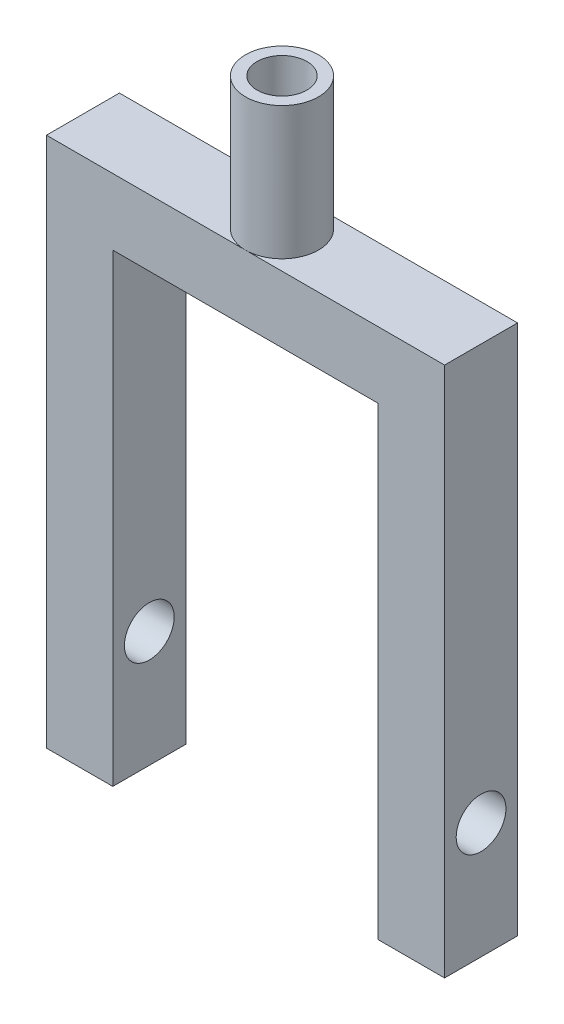
ISO-10303-21;
HEADER;
FILE_DESCRIPTION(('STEP AP214'),'2;1');
FILE_NAME('part.step','',(''),(''),'','','');
FILE_SCHEMA(('AUTOMOTIVE_DESIGN { 1 0 10303 214 1 1 1 1 }'));
ENDSEC;
DATA;
#1=APPLICATION_CONTEXT('core data for automotive mechanical design processes');
#2=APPLICATION_PROTOCOL_DEFINITION('international standard','automotive_design',2000,#1);
#3=PRODUCT_CONTEXT('',#1,'mechanical');
#4=PRODUCT('Part','Part','',(#3));
#5=PRODUCT_RELATED_PRODUCT_CATEGORY('part','',(#4));
#6=PRODUCT_DEFINITION_FORMATION('','',#4);
#7=PRODUCT_DEFINITION_CONTEXT('part definition',#1,'design');
#8=PRODUCT_DEFINITION('design','',#6,#7);
#9=PRODUCT_DEFINITION_SHAPE('','',#8);
#10=(LENGTH_UNIT() NAMED_UNIT(*) SI_UNIT(.MILLI.,.METRE.));
#11=(NAMED_UNIT(*) PLANE_ANGLE_UNIT() SI_UNIT($,.RADIAN.));
#12=(NAMED_UNIT(*) SI_UNIT($,.STERADIAN.) SOLID_ANGLE_UNIT());
#13=UNCERTAINTY_MEASURE_WITH_UNIT(LENGTH_MEASURE(1.E-05),#10,'distance_accuracy_value','');
#14=(GEOMETRIC_REPRESENTATION_CONTEXT(3) GLOBAL_UNCERTAINTY_ASSIGNED_CONTEXT((#13)) GLOBAL_UNIT_ASSIGNED_CONTEXT((#10,
#11,#12)) REPRESENTATION_CONTEXT('',''));
#15=CARTESIAN_POINT('',(0.,0.,0.));
#16=DIRECTION('',(0.,0.,1.));
#17=DIRECTION('',(1.,0.,0.));
#18=AXIS2_PLACEMENT_3D('',#15,#16,#17);
#19=CARTESIAN_POINT('',(0.,-127.,0.));
#20=DIRECTION('',(0.,-1.,0.));
#21=DIRECTION('',(0.,0.,-1.));
#22=AXIS2_PLACEMENT_3D('',#19,#20,#21);
#23=PLANE('',#22);
#24=DIRECTION('',(0.,0.,-1.));
#25=VECTOR('',#24,1.);
#26=CARTESIAN_POINT('',(25.3999999999999,-127.,6.98500000000001));
#27=LINE('',#26,#25);
#28=CARTESIAN_POINT('',(25.3999999999999,-127.,6.98500000000001));
#29=VERTEX_POINT('',#28);
#30=CARTESIAN_POINT('',(25.3999999999999,-127.,-6.985));
#31=VERTEX_POINT('',#30);
#32=EDGE_CURVE('E107',#29,#31,#27,.T.);
#33=ORIENTED_EDGE('',*,*,#32,.T.);
#34=DIRECTION('',(1.,0.,0.));
#35=VECTOR('',#34,1.);
#36=CARTESIAN_POINT('',(-38.1,-127.,-6.98500000000001));
#37=LINE('',#36,#35);
#38=CARTESIAN_POINT('',(38.1,-127.,-6.985));
#39=VERTEX_POINT('',#38);
#40=EDGE_CURVE('E131',#31,#39,#37,.T.);
#41=ORIENTED_EDGE('',*,*,#40,.T.);
#42=DIRECTION('',(0.,0.,1.));
#43=VECTOR('',#42,1.);
#44=CARTESIAN_POINT('',(38.1,-127.,6.985));
#45=LINE('',#44,#43);
#46=CARTESIAN_POINT('',(38.1,-127.,6.985));
#47=VERTEX_POINT('',#46);
#48=EDGE_CURVE('E126',#39,#47,#45,.T.);
#49=ORIENTED_EDGE('',*,*,#48,.T.);
#50=DIRECTION('',(-1.,0.,0.));
#51=VECTOR('',#50,1.);
#52=CARTESIAN_POINT('',(-38.1,-127.,6.98499999999999));
#53=LINE('',#52,#51);
#54=EDGE_CURVE('E119',#47,#29,#53,.T.);
#55=ORIENTED_EDGE('',*,*,#54,.T.);
#56=EDGE_LOOP('',(#33,#41,#49,#55));
#57=FACE_BOUND('',#56,.T.);
#58=ADVANCED_FACE('F34',(#57),#23,.T.);
#59=CARTESIAN_POINT('',(0.,-25.4,0.));
#60=DIRECTION('',(0.,1.,0.));
#61=DIRECTION('',(0.,0.,1.));
#62=AXIS2_PLACEMENT_3D('',#59,#60,#61);
#63=CYLINDRICAL_SURFACE('',#62,6.985);
#64=CARTESIAN_POINT('',(0.,-25.4,0.));
#65=DIRECTION('',(0.,1.,0.));
#66=DIRECTION('',(0.,0.,1.));
#67=AXIS2_PLACEMENT_3D('',#64,#65,#66);
#68=CIRCLE('',#67,6.985);
#69=CARTESIAN_POINT('',(0.,-25.4,6.985));
#70=VERTEX_POINT('',#69);
#71=CARTESIAN_POINT('',(0.,-25.4,-6.985));
#72=VERTEX_POINT('',#71);
#73=EDGE_CURVE('E11',#70,#72,#68,.T.);
#74=ORIENTED_EDGE('',*,*,#73,.T.);
#75=EDGE_CURVE('E43',#72,#70,#68,.T.);
#76=ORIENTED_EDGE('',*,*,#75,.T.);
#77=EDGE_LOOP('',(#74,#76));
#78=FACE_BOUND('',#77,.T.);
#79=CARTESIAN_POINT('',(0.,0.,0.));
#80=DIRECTION('',(0.,1.,0.));
#81=DIRECTION('',(0.,0.,1.));
#82=AXIS2_PLACEMENT_3D('',#79,#80,#81);
#83=CIRCLE('',#82,6.985);
#84=CARTESIAN_POINT('',(0.,0.,6.985));
#85=VERTEX_POINT('',#84);
#86=EDGE_CURVE('E163',#85,#85,#83,.T.);
#87=ORIENTED_EDGE('',*,*,#86,.F.);
#88=EDGE_LOOP('',(#87));
#89=FACE_BOUND('',#88,.T.);
#90=ADVANCED_FACE('F36',(#78,#89),#63,.T.);
#91=CARTESIAN_POINT('',(0.,0.,0.));
#92=DIRECTION('',(0.,1.,0.));
#93=DIRECTION('',(0.,0.,1.));
#94=AXIS2_PLACEMENT_3D('',#91,#92,#93);
#95=PLANE('',#94);
#96=CARTESIAN_POINT('',(0.,0.,0.));
#97=DIRECTION('',(0.,1.,0.));
#98=DIRECTION('',(0.,0.,1.));
#99=AXIS2_PLACEMENT_3D('',#96,#97,#98);
#100=CIRCLE('',#99,4.7625);
#101=CARTESIAN_POINT('',(0.,0.,4.7625));
#102=VERTEX_POINT('',#101);
#103=EDGE_CURVE('E161',#102,#102,#100,.T.);
#104=ORIENTED_EDGE('',*,*,#103,.F.);
#105=EDGE_LOOP('',(#104));
#106=FACE_BOUND('',#105,.T.);
#107=ORIENTED_EDGE('',*,*,#86,.T.);
#108=EDGE_LOOP('',(#107));
#109=FACE_BOUND('',#108,.T.);
#110=ADVANCED_FACE('F236',(#106,#109),#95,.T.);
#111=CARTESIAN_POINT('',(0.,-63.5,0.));
#112=DIRECTION('',(0.,1.,0.));
#113=DIRECTION('',(0.,0.,1.));
#114=AXIS2_PLACEMENT_3D('',#111,#112,#113);
#115=CYLINDRICAL_SURFACE('',#114,4.7625);
#116=ORIENTED_EDGE('',*,*,#103,.T.);
#117=EDGE_LOOP('',(#116));
#118=FACE_BOUND('',#117,.T.);
#119=CARTESIAN_POINT('',(0.,-38.1,0.));
#120=DIRECTION('',(0.,1.,0.));
#121=DIRECTION('',(-1.,0.,0.));
#122=AXIS2_PLACEMENT_3D('',#119,#120,#121);
#123=CIRCLE('',#122,4.7625);
#124=CARTESIAN_POINT('',(-4.7625,-38.1,0.));
#125=VERTEX_POINT('',#124);
#126=EDGE_CURVE('E166',#125,#125,#123,.T.);
#127=ORIENTED_EDGE('',*,*,#126,.F.);
#128=EDGE_LOOP('',(#127));
#129=FACE_BOUND('',#128,.T.);
#130=ADVANCED_FACE('F244',(#118,#129),#115,.F.);
#131=CARTESIAN_POINT('',(0.,-25.4,0.));
#132=DIRECTION('',(0.,-1.,0.));
#133=DIRECTION('',(0.,0.,-1.));
#134=AXIS2_PLACEMENT_3D('',#131,#132,#133);
#135=PLANE('',#134);
#136=ORIENTED_EDGE('',*,*,#75,.F.);
#137=DIRECTION('',(1.,0.,0.));
#138=VECTOR('',#137,1.);
#139=CARTESIAN_POINT('',(-38.1,-25.4,-6.98500000000001));
#140=LINE('',#139,#138);
#141=CARTESIAN_POINT('',(-38.1,-25.4,-6.98500000000001));
#142=VERTEX_POINT('',#141);
#143=EDGE_CURVE('E148',#142,#72,#140,.T.);
#144=ORIENTED_EDGE('',*,*,#143,.F.);
#145=DIRECTION('',(0.,0.,-1.));
#146=VECTOR('',#145,1.);
#147=CARTESIAN_POINT('',(-38.1,-25.4,6.98499999999999));
#148=LINE('',#147,#146);
#149=CARTESIAN_POINT('',(-38.1,-25.4,6.98499999999999));
#150=VERTEX_POINT('',#149);
#151=EDGE_CURVE('E145',#150,#142,#148,.T.);
#152=ORIENTED_EDGE('',*,*,#151,.F.);
#153=DIRECTION('',(-1.,0.,0.));
#154=VECTOR('',#153,1.);
#155=CARTESIAN_POINT('',(-38.1,-25.4,6.98499999999999));
#156=LINE('',#155,#154);
#157=EDGE_CURVE('E142',#70,#150,#156,.T.);
#158=ORIENTED_EDGE('',*,*,#157,.F.);
#159=EDGE_LOOP('',(#136,#144,#152,#158));
#160=FACE_BOUND('',#159,.T.);
#161=ADVANCED_FACE('F210',(#160),#135,.F.);
#162=DIRECTION('',(0.,0.,-1.));
#163=VECTOR('',#162,1.);
#164=CARTESIAN_POINT('',(-25.4000000000001,-127.,6.98500000000001));
#165=LINE('',#164,#163);
#166=CARTESIAN_POINT('',(-25.4000000000001,-127.,6.98500000000001));
#167=VERTEX_POINT('',#166);
#168=CARTESIAN_POINT('',(-25.4000000000001,-127.,-6.985));
#169=VERTEX_POINT('',#168);
#170=EDGE_CURVE('E116',#167,#169,#165,.T.);
#171=ORIENTED_EDGE('',*,*,#170,.F.);
#172=CARTESIAN_POINT('',(-38.1,-127.,6.98499999999999));
#173=VERTEX_POINT('',#172);
#174=EDGE_CURVE('E129',#167,#173,#53,.T.);
#175=ORIENTED_EDGE('',*,*,#174,.T.);
#176=DIRECTION('',(0.,0.,-1.));
#177=VECTOR('',#176,1.);
#178=CARTESIAN_POINT('',(-38.1,-127.,6.98499999999999));
#179=LINE('',#178,#177);
#180=CARTESIAN_POINT('',(-38.1,-127.,-6.98500000000001));
#181=VERTEX_POINT('',#180);
#182=EDGE_CURVE('E128',#173,#181,#179,.T.);
#183=ORIENTED_EDGE('',*,*,#182,.T.);
#184=EDGE_CURVE('E135',#181,#169,#37,.T.);
#185=ORIENTED_EDGE('',*,*,#184,.T.);
#186=EDGE_LOOP('',(#171,#175,#183,#185));
#187=FACE_BOUND('',#186,.T.);
#188=ADVANCED_FACE('F201',(#187),#23,.T.);
#189=CARTESIAN_POINT('',(-38.1,-127.,-6.98500000000001));
#190=DIRECTION('',(0.,0.,1.));
#191=DIRECTION('',(1.,0.,0.));
#192=AXIS2_PLACEMENT_3D('',#189,#190,#191);
#193=PLANE('',#192);
#194=ORIENTED_EDGE('',*,*,#40,.F.);
#195=DIRECTION('',(0.,-1.,0.));
#196=VECTOR('',#195,1.);
#197=CARTESIAN_POINT('',(25.3999999999999,-38.1,-6.985));
#198=LINE('',#197,#196);
#199=CARTESIAN_POINT('',(25.3999999999999,-38.1,-6.985));
#200=VERTEX_POINT('',#199);
#201=EDGE_CURVE('E112',#200,#31,#198,.T.);
#202=ORIENTED_EDGE('',*,*,#201,.F.);
#203=DIRECTION('',(1.,0.,0.));
#204=VECTOR('',#203,1.);
#205=CARTESIAN_POINT('',(-25.4000000000001,-38.1,-6.985));
#206=LINE('',#205,#204);
#207=CARTESIAN_POINT('',(-25.4000000000001,-38.1,-6.985));
#208=VERTEX_POINT('',#207);
#209=EDGE_CURVE('E123',#208,#200,#206,.T.);
#210=ORIENTED_EDGE('',*,*,#209,.F.);
#211=DIRECTION('',(0.,1.,0.));
#212=VECTOR('',#211,1.);
#213=CARTESIAN_POINT('',(-25.4000000000001,-38.1,-6.985));
#214=LINE('',#213,#212);
#215=EDGE_CURVE('E171',#169,#208,#214,.T.);
#216=ORIENTED_EDGE('',*,*,#215,.F.);
#217=ORIENTED_EDGE('',*,*,#184,.F.);
#218=DIRECTION('',(0.,1.,0.));
#219=VECTOR('',#218,1.);
#220=CARTESIAN_POINT('',(-38.1,-127.,-6.98500000000001));
#221=LINE('',#220,#219);
#222=EDGE_CURVE('E153',#181,#142,#221,.T.);
#223=ORIENTED_EDGE('',*,*,#222,.T.);
#224=ORIENTED_EDGE('',*,*,#143,.T.);
#225=CARTESIAN_POINT('',(38.1,-25.4,-6.985));
#226=VERTEX_POINT('',#225);
#227=EDGE_CURVE('E147',#72,#226,#140,.T.);
#228=ORIENTED_EDGE('',*,*,#227,.T.);
#229=DIRECTION('',(0.,1.,0.));
#230=VECTOR('',#229,1.);
#231=CARTESIAN_POINT('',(38.1,-127.,-6.985));
#232=LINE('',#231,#230);
#233=EDGE_CURVE('E138',#39,#226,#232,.T.);
#234=ORIENTED_EDGE('',*,*,#233,.F.);
#235=EDGE_LOOP('',(#194,#202,#210,#216,#217,#223,#224,#228,#234));
#236=FACE_BOUND('',#235,.T.);
#237=ADVANCED_FACE('F200',(#236),#193,.F.);
#238=CARTESIAN_POINT('',(-38.1,-127.,6.98499999999999));
#239=DIRECTION('',(1.,0.,0.));
#240=DIRECTION('',(0.,0.,-1.));
#241=AXIS2_PLACEMENT_3D('',#238,#239,#240);
#242=PLANE('',#241);
#243=CARTESIAN_POINT('',(-38.1,-104.775,0.));
#244=DIRECTION('',(-1.,0.,0.));
#245=DIRECTION('',(0.,0.,1.));
#246=AXIS2_PLACEMENT_3D('',#243,#244,#245);
#247=CIRCLE('',#246,4.7625);
#248=CARTESIAN_POINT('',(-38.1,-104.775,4.76249999999999));
#249=VERTEX_POINT('',#248);
#250=EDGE_CURVE('E256',#249,#249,#247,.T.);
#251=ORIENTED_EDGE('',*,*,#250,.F.);
#252=EDGE_LOOP('',(#251));
#253=FACE_BOUND('',#252,.T.);
#254=ORIENTED_EDGE('',*,*,#151,.T.);
#255=ORIENTED_EDGE('',*,*,#222,.F.);
#256=ORIENTED_EDGE('',*,*,#182,.F.);
#257=DIRECTION('',(0.,1.,0.));
#258=VECTOR('',#257,1.);
#259=CARTESIAN_POINT('',(-38.1,-127.,6.98499999999999));
#260=LINE('',#259,#258);
#261=EDGE_CURVE('E156',#173,#150,#260,.T.);
#262=ORIENTED_EDGE('',*,*,#261,.T.);
#263=EDGE_LOOP('',(#254,#255,#256,#262));
#264=FACE_BOUND('',#263,.T.);
#265=ADVANCED_FACE('F206',(#253,#264),#242,.F.);
#266=CARTESIAN_POINT('',(-38.1,-127.,6.98499999999999));
#267=DIRECTION('',(0.,0.,-1.));
#268=DIRECTION('',(-1.,0.,0.));
#269=AXIS2_PLACEMENT_3D('',#266,#267,#268);
#270=PLANE('',#269);
#271=DIRECTION('',(1.,0.,0.));
#272=VECTOR('',#271,1.);
#273=CARTESIAN_POINT('',(-25.4000000000001,-38.1,6.98500000000001));
#274=LINE('',#273,#272);
#275=CARTESIAN_POINT('',(-25.4000000000001,-38.1,6.985));
#276=VERTEX_POINT('',#275);
#277=CARTESIAN_POINT('',(25.3999999999999,-38.1,6.98500000000001));
#278=VERTEX_POINT('',#277);
#279=EDGE_CURVE('E51',#276,#278,#274,.T.);
#280=ORIENTED_EDGE('',*,*,#279,.T.);
#281=DIRECTION('',(0.,-1.,0.));
#282=VECTOR('',#281,1.);
#283=CARTESIAN_POINT('',(25.3999999999999,-38.1,6.98500000000001));
#284=LINE('',#283,#282);
#285=EDGE_CURVE('E110',#278,#29,#284,.T.);
#286=ORIENTED_EDGE('',*,*,#285,.T.);
#287=ORIENTED_EDGE('',*,*,#54,.F.);
#288=DIRECTION('',(0.,1.,0.));
#289=VECTOR('',#288,1.);
#290=CARTESIAN_POINT('',(38.1,-127.,6.985));
#291=LINE('',#290,#289);
#292=CARTESIAN_POINT('',(38.1,-25.4,6.985));
#293=VERTEX_POINT('',#292);
#294=EDGE_CURVE('E159',#47,#293,#291,.T.);
#295=ORIENTED_EDGE('',*,*,#294,.T.);
#296=EDGE_CURVE('E59',#293,#70,#156,.T.);
#297=ORIENTED_EDGE('',*,*,#296,.T.);
#298=ORIENTED_EDGE('',*,*,#157,.T.);
#299=ORIENTED_EDGE('',*,*,#261,.F.);
#300=ORIENTED_EDGE('',*,*,#174,.F.);
#301=DIRECTION('',(0.,1.,0.));
#302=VECTOR('',#301,1.);
#303=CARTESIAN_POINT('',(-25.4000000000001,-38.1,6.98500000000001));
#304=LINE('',#303,#302);
#305=EDGE_CURVE('E122',#167,#276,#304,.T.);
#306=ORIENTED_EDGE('',*,*,#305,.T.);
#307=EDGE_LOOP('',(#280,#286,#287,#295,#297,#298,#299,#300,#306));
#308=FACE_BOUND('',#307,.T.);
#309=ADVANCED_FACE('F118',(#308),#270,.F.);
#310=CARTESIAN_POINT('',(38.1,-127.,6.985));
#311=DIRECTION('',(-1.,0.,0.));
#312=DIRECTION('',(0.,0.,1.));
#313=AXIS2_PLACEMENT_3D('',#310,#311,#312);
#314=PLANE('',#313);
#315=CARTESIAN_POINT('',(38.1,-104.775,0.));
#316=DIRECTION('',(-1.,0.,0.));
#317=DIRECTION('',(0.,0.,1.));
#318=AXIS2_PLACEMENT_3D('',#315,#316,#317);
#319=CIRCLE('',#318,4.7625);
#320=CARTESIAN_POINT('',(38.1,-104.775,4.7625));
#321=VERTEX_POINT('',#320);
#322=EDGE_CURVE('E168',#321,#321,#319,.F.);
#323=ORIENTED_EDGE('',*,*,#322,.F.);
#324=EDGE_LOOP('',(#323));
#325=FACE_BOUND('',#324,.T.);
#326=DIRECTION('',(0.,0.,1.));
#327=VECTOR('',#326,1.);
#328=CARTESIAN_POINT('',(38.1,-25.4,6.985));
#329=LINE('',#328,#327);
#330=EDGE_CURVE('E139',#226,#293,#329,.T.);
#331=ORIENTED_EDGE('',*,*,#330,.T.);
#332=ORIENTED_EDGE('',*,*,#294,.F.);
#333=ORIENTED_EDGE('',*,*,#48,.F.);
#334=ORIENTED_EDGE('',*,*,#233,.T.);
#335=EDGE_LOOP('',(#331,#332,#333,#334));
#336=FACE_BOUND('',#335,.T.);
#337=ADVANCED_FACE('F220',(#325,#336),#314,.F.);
#338=ORIENTED_EDGE('',*,*,#73,.F.);
#339=ORIENTED_EDGE('',*,*,#296,.F.);
#340=ORIENTED_EDGE('',*,*,#330,.F.);
#341=ORIENTED_EDGE('',*,*,#227,.F.);
#342=EDGE_LOOP('',(#338,#339,#340,#341));
#343=FACE_BOUND('',#342,.T.);
#344=ADVANCED_FACE('F217',(#343),#135,.F.);
#345=CARTESIAN_POINT('',(25.3999999999999,-38.1,6.98500000000001));
#346=DIRECTION('',(1.,0.,0.));
#347=DIRECTION('',(0.,1.,0.));
#348=AXIS2_PLACEMENT_3D('',#345,#346,#347);
#349=PLANE('',#348);
#350=CARTESIAN_POINT('',(25.3999999999999,-104.775,0.));
#351=DIRECTION('',(1.,0.,0.));
#352=DIRECTION('',(0.,1.,0.));
#353=AXIS2_PLACEMENT_3D('',#350,#351,#352);
#354=CIRCLE('',#353,4.7625);
#355=CARTESIAN_POINT('',(25.3999999999999,-100.0125,0.));
#356=VERTEX_POINT('',#355);
#357=EDGE_CURVE('E174',#356,#356,#354,.F.);
#358=ORIENTED_EDGE('',*,*,#357,.F.);
#359=EDGE_LOOP('',(#358));
#360=FACE_BOUND('',#359,.T.);
#361=ORIENTED_EDGE('',*,*,#201,.T.);
#362=ORIENTED_EDGE('',*,*,#32,.F.);
#363=ORIENTED_EDGE('',*,*,#285,.F.);
#364=DIRECTION('',(0.,0.,-1.));
#365=VECTOR('',#364,1.);
#366=CARTESIAN_POINT('',(25.3999999999999,-38.1,6.98500000000001));
#367=LINE('',#366,#365);
#368=EDGE_CURVE('E143',#278,#200,#367,.T.);
#369=ORIENTED_EDGE('',*,*,#368,.T.);
#370=EDGE_LOOP('',(#361,#362,#363,#369));
#371=FACE_BOUND('',#370,.T.);
#372=ADVANCED_FACE('F109',(#360,#371),#349,.F.);
#373=CARTESIAN_POINT('',(-25.4000000000001,-38.1,6.98500000000001));
#374=DIRECTION('',(0.,1.,0.));
#375=DIRECTION('',(-1.,0.,0.));
#376=AXIS2_PLACEMENT_3D('',#373,#374,#375);
#377=PLANE('',#376);
#378=ORIENTED_EDGE('',*,*,#126,.T.);
#379=EDGE_LOOP('',(#378));
#380=FACE_BOUND('',#379,.T.);
#381=ORIENTED_EDGE('',*,*,#209,.T.);
#382=ORIENTED_EDGE('',*,*,#368,.F.);
#383=ORIENTED_EDGE('',*,*,#279,.F.);
#384=DIRECTION('',(0.,0.,-1.));
#385=VECTOR('',#384,1.);
#386=CARTESIAN_POINT('',(-25.4000000000001,-38.1,6.98500000000001));
#387=LINE('',#386,#385);
#388=EDGE_CURVE('E189',#276,#208,#387,.T.);
#389=ORIENTED_EDGE('',*,*,#388,.T.);
#390=EDGE_LOOP('',(#381,#382,#383,#389));
#391=FACE_BOUND('',#390,.T.);
#392=ADVANCED_FACE('F264',(#380,#391),#377,.F.);
#393=CARTESIAN_POINT('',(-25.4000000000001,-38.1,6.98500000000001));
#394=DIRECTION('',(-1.,0.,0.));
#395=DIRECTION('',(0.,0.,1.));
#396=AXIS2_PLACEMENT_3D('',#393,#394,#395);
#397=PLANE('',#396);
#398=CARTESIAN_POINT('',(-25.4000000000001,-104.775,0.));
#399=DIRECTION('',(-1.,0.,0.));
#400=DIRECTION('',(0.,0.,1.));
#401=AXIS2_PLACEMENT_3D('',#398,#399,#400);
#402=CIRCLE('',#401,4.7625);
#403=CARTESIAN_POINT('',(-25.4000000000001,-104.775,4.76249999999999));
#404=VERTEX_POINT('',#403);
#405=EDGE_CURVE('E38',#404,#404,#402,.F.);
#406=ORIENTED_EDGE('',*,*,#405,.F.);
#407=EDGE_LOOP('',(#406));
#408=FACE_BOUND('',#407,.T.);
#409=ORIENTED_EDGE('',*,*,#215,.T.);
#410=ORIENTED_EDGE('',*,*,#388,.F.);
#411=ORIENTED_EDGE('',*,*,#305,.F.);
#412=ORIENTED_EDGE('',*,*,#170,.T.);
#413=EDGE_LOOP('',(#409,#410,#411,#412));
#414=FACE_BOUND('',#413,.T.);
#415=ADVANCED_FACE('F194',(#408,#414),#397,.F.);
#416=CARTESIAN_POINT('',(-38.1,-104.775,0.));
#417=DIRECTION('',(1.,0.,0.));
#418=DIRECTION('',(0.,0.,-1.));
#419=AXIS2_PLACEMENT_3D('',#416,#417,#418);
#420=CYLINDRICAL_SURFACE('',#419,4.7625);
#421=ORIENTED_EDGE('',*,*,#250,.T.);
#422=EDGE_LOOP('',(#421));
#423=FACE_BOUND('',#422,.T.);
#424=ORIENTED_EDGE('',*,*,#405,.T.);
#425=EDGE_LOOP('',(#424));
#426=FACE_BOUND('',#425,.T.);
#427=ADVANCED_FACE('F261',(#423,#426),#420,.F.);
#428=ORIENTED_EDGE('',*,*,#357,.T.);
#429=EDGE_LOOP('',(#428));
#430=FACE_BOUND('',#429,.T.);
#431=ORIENTED_EDGE('',*,*,#322,.T.);
#432=EDGE_LOOP('',(#431));
#433=FACE_BOUND('',#432,.T.);
#434=ADVANCED_FACE('F270',(#430,#433),#420,.F.);
#435=CLOSED_SHELL('',(#58,#90,#110,#130,#161,#188,#237,#265,#309,#337,#344,#372,#392,#415,#427,#434));
#436=MANIFOLD_SOLID_BREP('B2',#435);
#437=ADVANCED_BREP_SHAPE_REPRESENTATION('',(#18,#436),#14);
#438=SHAPE_DEFINITION_REPRESENTATION(#9,#437);
ENDSEC;
END-ISO-10303-21;
